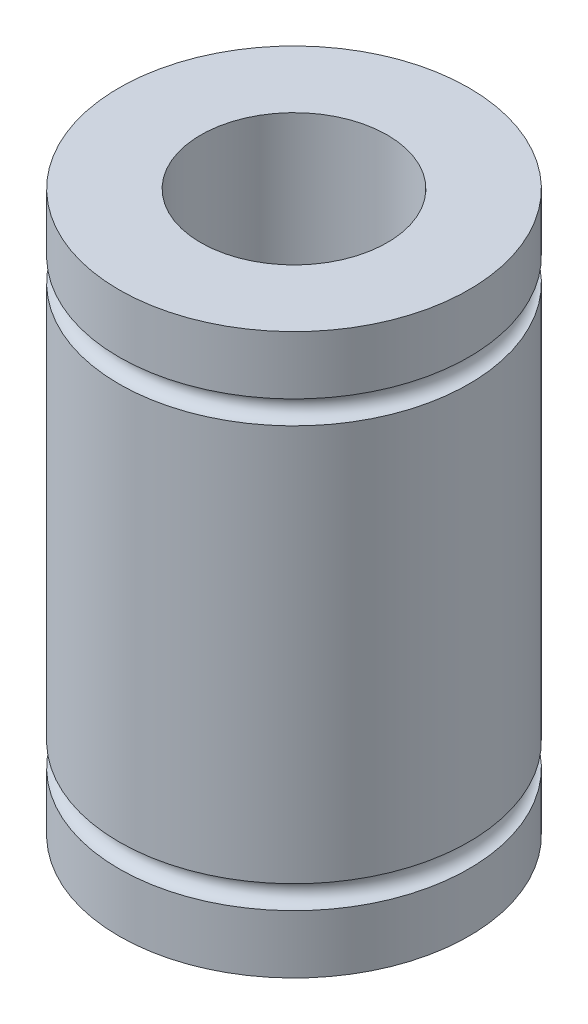
ISO-10303-21;
HEADER;
FILE_DESCRIPTION(('STEP AP214'),'2;1');
FILE_NAME('part.step','',(''),(''),'','','');
FILE_SCHEMA(('AUTOMOTIVE_DESIGN { 1 0 10303 214 1 1 1 1 }'));
ENDSEC;
DATA;
#1=APPLICATION_CONTEXT('core data for automotive mechanical design processes');
#2=APPLICATION_PROTOCOL_DEFINITION('international standard','automotive_design',2000,#1);
#3=PRODUCT_CONTEXT('',#1,'mechanical');
#4=PRODUCT('Part','Part','',(#3));
#5=PRODUCT_RELATED_PRODUCT_CATEGORY('part','',(#4));
#6=PRODUCT_DEFINITION_FORMATION('','',#4);
#7=PRODUCT_DEFINITION_CONTEXT('part definition',#1,'design');
#8=PRODUCT_DEFINITION('design','',#6,#7);
#9=PRODUCT_DEFINITION_SHAPE('','',#8);
#10=(LENGTH_UNIT() NAMED_UNIT(*) SI_UNIT(.MILLI.,.METRE.));
#11=(NAMED_UNIT(*) PLANE_ANGLE_UNIT() SI_UNIT($,.RADIAN.));
#12=(NAMED_UNIT(*) SI_UNIT($,.STERADIAN.) SOLID_ANGLE_UNIT());
#13=UNCERTAINTY_MEASURE_WITH_UNIT(LENGTH_MEASURE(1.E-05),#10,'distance_accuracy_value','');
#14=(GEOMETRIC_REPRESENTATION_CONTEXT(3) GLOBAL_UNCERTAINTY_ASSIGNED_CONTEXT((#13)) GLOBAL_UNIT_ASSIGNED_CONTEXT((#10,
#11,#12)) REPRESENTATION_CONTEXT('',''));
#15=CARTESIAN_POINT('',(0.,0.,0.));
#16=DIRECTION('',(0.,0.,1.));
#17=DIRECTION('',(1.,0.,0.));
#18=AXIS2_PLACEMENT_3D('',#15,#16,#17);
#19=CARTESIAN_POINT('',(0.,24.,0.));
#20=DIRECTION('',(0.,-1.,0.));
#21=DIRECTION('',(0.,0.,-1.));
#22=AXIS2_PLACEMENT_3D('',#19,#20,#21);
#23=CYLINDRICAL_SURFACE('',#22,7.5);
#24=CARTESIAN_POINT('',(0.,3.5,0.));
#25=DIRECTION('',(0.,-1.,0.));
#26=DIRECTION('',(0.,0.,-1.));
#27=AXIS2_PLACEMENT_3D('',#24,#25,#26);
#28=CIRCLE('',#27,7.5);
#29=CARTESIAN_POINT('',(0.,3.5,-7.5));
#30=VERTEX_POINT('',#29);
#31=EDGE_CURVE('E54',#30,#30,#28,.F.);
#32=ORIENTED_EDGE('',*,*,#31,.T.);
#33=EDGE_LOOP('',(#32));
#34=FACE_BOUND('',#33,.T.);
#35=CARTESIAN_POINT('',(0.,20.5,0.));
#36=DIRECTION('',(0.,1.,0.));
#37=DIRECTION('',(0.,0.,1.));
#38=AXIS2_PLACEMENT_3D('',#35,#36,#37);
#39=CIRCLE('',#38,7.5);
#40=CARTESIAN_POINT('',(0.,20.5,7.5));
#41=VERTEX_POINT('',#40);
#42=EDGE_CURVE('E36',#41,#41,#39,.T.);
#43=ORIENTED_EDGE('',*,*,#42,.F.);
#44=EDGE_LOOP('',(#43));
#45=FACE_BOUND('',#44,.T.);
#46=ADVANCED_FACE('F32',(#34,#45),#23,.T.);
#47=CARTESIAN_POINT('',(0.,24.,0.));
#48=DIRECTION('',(0.,1.,0.));
#49=DIRECTION('',(0.,0.,1.));
#50=AXIS2_PLACEMENT_3D('',#47,#48,#49);
#51=CIRCLE('',#50,7.5);
#52=CARTESIAN_POINT('',(0.,24.,7.5));
#53=VERTEX_POINT('',#52);
#54=EDGE_CURVE('E10',#53,#53,#51,.T.);
#55=ORIENTED_EDGE('',*,*,#54,.F.);
#56=EDGE_LOOP('',(#55));
#57=FACE_BOUND('',#56,.T.);
#58=CARTESIAN_POINT('',(0.,21.5,0.));
#59=DIRECTION('',(0.,-1.,0.));
#60=DIRECTION('',(0.,0.,-1.));
#61=AXIS2_PLACEMENT_3D('',#58,#59,#60);
#62=CIRCLE('',#61,7.5);
#63=CARTESIAN_POINT('',(0.,21.5,-7.5));
#64=VERTEX_POINT('',#63);
#65=EDGE_CURVE('E56',#64,#64,#62,.T.);
#66=ORIENTED_EDGE('',*,*,#65,.F.);
#67=EDGE_LOOP('',(#66));
#68=FACE_BOUND('',#67,.T.);
#69=ADVANCED_FACE('F66',(#57,#68),#23,.T.);
#70=CARTESIAN_POINT('',(0.,2.5,0.));
#71=DIRECTION('',(0.,1.,0.));
#72=DIRECTION('',(0.,0.,1.));
#73=AXIS2_PLACEMENT_3D('',#70,#71,#72);
#74=CIRCLE('',#73,7.5);
#75=CARTESIAN_POINT('',(0.,2.5,7.5));
#76=VERTEX_POINT('',#75);
#77=EDGE_CURVE('E51',#76,#76,#74,.F.);
#78=ORIENTED_EDGE('',*,*,#77,.T.);
#79=EDGE_LOOP('',(#78));
#80=FACE_BOUND('',#79,.T.);
#81=CARTESIAN_POINT('',(0.,0.,0.));
#82=DIRECTION('',(0.,1.,0.));
#83=DIRECTION('',(0.,0.,1.));
#84=AXIS2_PLACEMENT_3D('',#81,#82,#83);
#85=CIRCLE('',#84,7.5);
#86=CARTESIAN_POINT('',(0.,0.,7.5));
#87=VERTEX_POINT('',#86);
#88=EDGE_CURVE('E40',#87,#87,#85,.T.);
#89=ORIENTED_EDGE('',*,*,#88,.T.);
#90=EDGE_LOOP('',(#89));
#91=FACE_BOUND('',#90,.T.);
#92=ADVANCED_FACE('F34',(#80,#91),#23,.T.);
#93=CARTESIAN_POINT('',(0.,24.,0.));
#94=DIRECTION('',(0.,1.,0.));
#95=DIRECTION('',(0.,0.,1.));
#96=AXIS2_PLACEMENT_3D('',#93,#94,#95);
#97=PLANE('',#96);
#98=CARTESIAN_POINT('',(0.,24.,0.));
#99=DIRECTION('',(0.,-1.,0.));
#100=DIRECTION('',(0.,0.,-1.));
#101=AXIS2_PLACEMENT_3D('',#98,#99,#100);
#102=CIRCLE('',#101,4.);
#103=CARTESIAN_POINT('',(0.,24.,-4.));
#104=VERTEX_POINT('',#103);
#105=EDGE_CURVE('E45',#104,#104,#102,.T.);
#106=ORIENTED_EDGE('',*,*,#105,.T.);
#107=EDGE_LOOP('',(#106));
#108=FACE_BOUND('',#107,.T.);
#109=ORIENTED_EDGE('',*,*,#54,.T.);
#110=EDGE_LOOP('',(#109));
#111=FACE_BOUND('',#110,.T.);
#112=ADVANCED_FACE('F73',(#108,#111),#97,.T.);
#113=CARTESIAN_POINT('',(0.,0.,0.));
#114=DIRECTION('',(0.,1.,0.));
#115=DIRECTION('',(0.,0.,1.));
#116=AXIS2_PLACEMENT_3D('',#113,#114,#115);
#117=PLANE('',#116);
#118=CARTESIAN_POINT('',(0.,0.,0.));
#119=DIRECTION('',(0.,-1.,0.));
#120=DIRECTION('',(0.,0.,-1.));
#121=AXIS2_PLACEMENT_3D('',#118,#119,#120);
#122=CIRCLE('',#121,4.);
#123=CARTESIAN_POINT('',(0.,0.,-4.));
#124=VERTEX_POINT('',#123);
#125=EDGE_CURVE('E48',#124,#124,#122,.T.);
#126=ORIENTED_EDGE('',*,*,#125,.F.);
#127=EDGE_LOOP('',(#126));
#128=FACE_BOUND('',#127,.T.);
#129=ORIENTED_EDGE('',*,*,#88,.F.);
#130=EDGE_LOOP('',(#129));
#131=FACE_BOUND('',#130,.T.);
#132=ADVANCED_FACE('F78',(#128,#131),#117,.F.);
#133=CARTESIAN_POINT('',(0.,24.,0.));
#134=DIRECTION('',(0.,-1.,0.));
#135=DIRECTION('',(0.,0.,-1.));
#136=AXIS2_PLACEMENT_3D('',#133,#134,#135);
#137=CYLINDRICAL_SURFACE('',#136,4.);
#138=ORIENTED_EDGE('',*,*,#105,.F.);
#139=EDGE_LOOP('',(#138));
#140=FACE_BOUND('',#139,.T.);
#141=ORIENTED_EDGE('',*,*,#125,.T.);
#142=EDGE_LOOP('',(#141));
#143=FACE_BOUND('',#142,.T.);
#144=ADVANCED_FACE('F86',(#140,#143),#137,.F.);
#145=CARTESIAN_POINT('',(0.,3.,0.));
#146=DIRECTION('',(0.,1.,0.));
#147=DIRECTION('',(0.,0.,1.));
#148=AXIS2_PLACEMENT_3D('',#145,#146,#147);
#149=TOROIDAL_SURFACE('',#148,7.5,0.500000000000001);
#150=ORIENTED_EDGE('',*,*,#77,.F.);
#151=EDGE_LOOP('',(#150));
#152=FACE_BOUND('',#151,.T.);
#153=ORIENTED_EDGE('',*,*,#31,.F.);
#154=EDGE_LOOP('',(#153));
#155=FACE_BOUND('',#154,.T.);
#156=ADVANCED_FACE('F91',(#152,#155),#149,.F.);
#157=CARTESIAN_POINT('',(0.,21.,0.));
#158=DIRECTION('',(0.,-1.,0.));
#159=DIRECTION('',(0.,0.,-1.));
#160=AXIS2_PLACEMENT_3D('',#157,#158,#159);
#161=TOROIDAL_SURFACE('',#160,7.5,0.500000000000001);
#162=ORIENTED_EDGE('',*,*,#65,.T.);
#163=EDGE_LOOP('',(#162));
#164=FACE_BOUND('',#163,.T.);
#165=ORIENTED_EDGE('',*,*,#42,.T.);
#166=EDGE_LOOP('',(#165));
#167=FACE_BOUND('',#166,.T.);
#168=ADVANCED_FACE('F63',(#164,#167),#161,.F.);
#169=CLOSED_SHELL('',(#46,#69,#92,#112,#132,#144,#156,#168));
#170=MANIFOLD_SOLID_BREP('B2',#169);
#171=ADVANCED_BREP_SHAPE_REPRESENTATION('',(#18,#170),#14);
#172=SHAPE_DEFINITION_REPRESENTATION(#9,#171);
ENDSEC;
END-ISO-10303-21;
